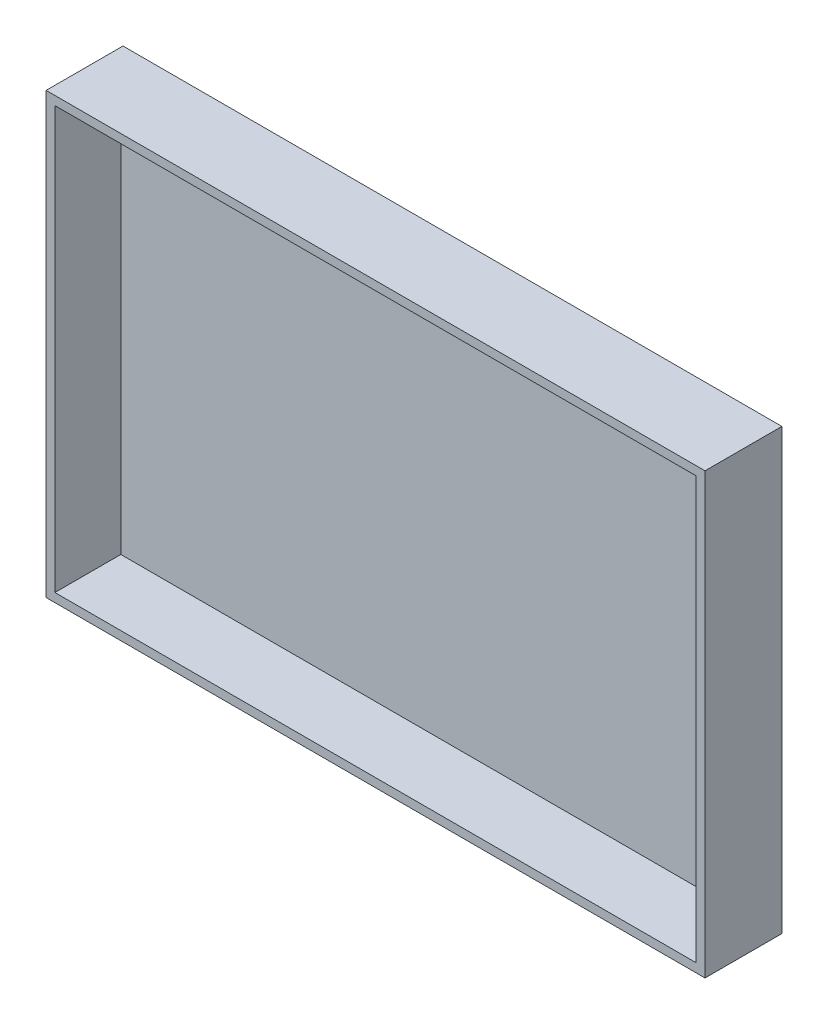
ISO-10303-21;
HEADER;
FILE_DESCRIPTION(('STEP AP214'),'2;1');
FILE_NAME('part.step','',(''),(''),'','','');
FILE_SCHEMA(('AUTOMOTIVE_DESIGN { 1 0 10303 214 1 1 1 1 }'));
ENDSEC;
DATA;
#1=APPLICATION_CONTEXT('core data for automotive mechanical design processes');
#2=APPLICATION_PROTOCOL_DEFINITION('international standard','automotive_design',2000,#1);
#3=PRODUCT_CONTEXT('',#1,'mechanical');
#4=PRODUCT('Part','Part','',(#3));
#5=PRODUCT_RELATED_PRODUCT_CATEGORY('part','',(#4));
#6=PRODUCT_DEFINITION_FORMATION('','',#4);
#7=PRODUCT_DEFINITION_CONTEXT('part definition',#1,'design');
#8=PRODUCT_DEFINITION('design','',#6,#7);
#9=PRODUCT_DEFINITION_SHAPE('','',#8);
#10=(LENGTH_UNIT() NAMED_UNIT(*) SI_UNIT(.MILLI.,.METRE.));
#11=(NAMED_UNIT(*) PLANE_ANGLE_UNIT() SI_UNIT($,.RADIAN.));
#12=(NAMED_UNIT(*) SI_UNIT($,.STERADIAN.) SOLID_ANGLE_UNIT());
#13=UNCERTAINTY_MEASURE_WITH_UNIT(LENGTH_MEASURE(1.E-05),#10,'distance_accuracy_value','');
#14=(GEOMETRIC_REPRESENTATION_CONTEXT(3) GLOBAL_UNCERTAINTY_ASSIGNED_CONTEXT((#13)) GLOBAL_UNIT_ASSIGNED_CONTEXT((#10,
#11,#12)) REPRESENTATION_CONTEXT('',''));
#15=CARTESIAN_POINT('',(0.,0.,0.));
#16=DIRECTION('',(0.,0.,1.));
#17=DIRECTION('',(1.,0.,0.));
#18=AXIS2_PLACEMENT_3D('',#15,#16,#17);
#19=CARTESIAN_POINT('',(0.,0.,10.));
#20=DIRECTION('',(1.,0.,0.));
#21=DIRECTION('',(0.,0.,-1.));
#22=AXIS2_PLACEMENT_3D('',#19,#20,#21);
#23=PLANE('',#22);
#24=DIRECTION('',(0.,-1.,0.));
#25=VECTOR('',#24,1.);
#26=CARTESIAN_POINT('',(0.,0.,0.));
#27=LINE('',#26,#25);
#28=CARTESIAN_POINT('',(0.,400.,0.));
#29=VERTEX_POINT('',#28);
#30=CARTESIAN_POINT('',(0.,0.,0.));
#31=VERTEX_POINT('',#30);
#32=EDGE_CURVE('E150',#29,#31,#27,.T.);
#33=ORIENTED_EDGE('',*,*,#32,.T.);
#34=DIRECTION('',(0.,0.,-1.));
#35=VECTOR('',#34,1.);
#36=CARTESIAN_POINT('',(0.,0.,10.));
#37=LINE('',#36,#35);
#38=CARTESIAN_POINT('',(0.,0.,70.));
#39=VERTEX_POINT('',#38);
#40=EDGE_CURVE('E11',#39,#31,#37,.T.);
#41=ORIENTED_EDGE('',*,*,#40,.F.);
#42=DIRECTION('',(0.,-1.,0.));
#43=VECTOR('',#42,1.);
#44=CARTESIAN_POINT('',(0.,400.,70.));
#45=LINE('',#44,#43);
#46=CARTESIAN_POINT('',(0.,400.,70.));
#47=VERTEX_POINT('',#46);
#48=EDGE_CURVE('E141',#47,#39,#45,.T.);
#49=ORIENTED_EDGE('',*,*,#48,.F.);
#50=DIRECTION('',(0.,0.,-1.));
#51=VECTOR('',#50,1.);
#52=CARTESIAN_POINT('',(0.,400.,10.));
#53=LINE('',#52,#51);
#54=EDGE_CURVE('E158',#47,#29,#53,.T.);
#55=ORIENTED_EDGE('',*,*,#54,.T.);
#56=EDGE_LOOP('',(#33,#41,#49,#55));
#57=FACE_BOUND('',#56,.T.);
#58=ADVANCED_FACE('F33',(#57),#23,.F.);
#59=CARTESIAN_POINT('',(0.,0.,10.));
#60=DIRECTION('',(0.,1.,0.));
#61=DIRECTION('',(0.,0.,1.));
#62=AXIS2_PLACEMENT_3D('',#59,#60,#61);
#63=PLANE('',#62);
#64=DIRECTION('',(1.,0.,0.));
#65=VECTOR('',#64,1.);
#66=CARTESIAN_POINT('',(0.,0.,0.));
#67=LINE('',#66,#65);
#68=CARTESIAN_POINT('',(600.,0.,0.));
#69=VERTEX_POINT('',#68);
#70=EDGE_CURVE('E153',#31,#69,#67,.T.);
#71=ORIENTED_EDGE('',*,*,#70,.T.);
#72=DIRECTION('',(0.,0.,-1.));
#73=VECTOR('',#72,1.);
#74=CARTESIAN_POINT('',(600.,0.,10.));
#75=LINE('',#74,#73);
#76=CARTESIAN_POINT('',(600.,0.,70.));
#77=VERTEX_POINT('',#76);
#78=EDGE_CURVE('E40',#77,#69,#75,.T.);
#79=ORIENTED_EDGE('',*,*,#78,.F.);
#80=DIRECTION('',(1.,0.,0.));
#81=VECTOR('',#80,1.);
#82=CARTESIAN_POINT('',(0.,0.,70.));
#83=LINE('',#82,#81);
#84=EDGE_CURVE('E144',#39,#77,#83,.T.);
#85=ORIENTED_EDGE('',*,*,#84,.F.);
#86=ORIENTED_EDGE('',*,*,#40,.T.);
#87=EDGE_LOOP('',(#71,#79,#85,#86));
#88=FACE_BOUND('',#87,.T.);
#89=ADVANCED_FACE('F176',(#88),#63,.F.);
#90=CARTESIAN_POINT('',(600.,0.,10.));
#91=DIRECTION('',(-1.,0.,0.));
#92=DIRECTION('',(0.,0.,1.));
#93=AXIS2_PLACEMENT_3D('',#90,#91,#92);
#94=PLANE('',#93);
#95=DIRECTION('',(0.,1.,0.));
#96=VECTOR('',#95,1.);
#97=CARTESIAN_POINT('',(600.,0.,0.));
#98=LINE('',#97,#96);
#99=CARTESIAN_POINT('',(600.,400.,0.));
#100=VERTEX_POINT('',#99);
#101=EDGE_CURVE('E155',#69,#100,#98,.T.);
#102=ORIENTED_EDGE('',*,*,#101,.T.);
#103=DIRECTION('',(0.,0.,-1.));
#104=VECTOR('',#103,1.);
#105=CARTESIAN_POINT('',(600.,400.,10.));
#106=LINE('',#105,#104);
#107=CARTESIAN_POINT('',(600.,400.,70.));
#108=VERTEX_POINT('',#107);
#109=EDGE_CURVE('E160',#108,#100,#106,.T.);
#110=ORIENTED_EDGE('',*,*,#109,.F.);
#111=DIRECTION('',(0.,1.,0.));
#112=VECTOR('',#111,1.);
#113=CARTESIAN_POINT('',(600.,0.,70.));
#114=LINE('',#113,#112);
#115=EDGE_CURVE('E147',#77,#108,#114,.T.);
#116=ORIENTED_EDGE('',*,*,#115,.F.);
#117=ORIENTED_EDGE('',*,*,#78,.T.);
#118=EDGE_LOOP('',(#102,#110,#116,#117));
#119=FACE_BOUND('',#118,.T.);
#120=ADVANCED_FACE('F165',(#119),#94,.F.);
#121=CARTESIAN_POINT('',(0.,400.,10.));
#122=DIRECTION('',(0.,-1.,0.));
#123=DIRECTION('',(0.,0.,-1.));
#124=AXIS2_PLACEMENT_3D('',#121,#122,#123);
#125=PLANE('',#124);
#126=DIRECTION('',(-1.,0.,0.));
#127=VECTOR('',#126,1.);
#128=CARTESIAN_POINT('',(0.,400.,0.));
#129=LINE('',#128,#127);
#130=EDGE_CURVE('E55',#100,#29,#129,.T.);
#131=ORIENTED_EDGE('',*,*,#130,.T.);
#132=ORIENTED_EDGE('',*,*,#54,.F.);
#133=DIRECTION('',(-1.,0.,0.));
#134=VECTOR('',#133,1.);
#135=CARTESIAN_POINT('',(600.,400.,70.));
#136=LINE('',#135,#134);
#137=EDGE_CURVE('E115',#108,#47,#136,.T.);
#138=ORIENTED_EDGE('',*,*,#137,.F.);
#139=ORIENTED_EDGE('',*,*,#109,.T.);
#140=EDGE_LOOP('',(#131,#132,#138,#139));
#141=FACE_BOUND('',#140,.T.);
#142=ADVANCED_FACE('F174',(#141),#125,.F.);
#143=CARTESIAN_POINT('',(0.,0.,0.));
#144=DIRECTION('',(0.,0.,-1.));
#145=DIRECTION('',(-1.,0.,0.));
#146=AXIS2_PLACEMENT_3D('',#143,#144,#145);
#147=PLANE('',#146);
#148=ORIENTED_EDGE('',*,*,#32,.F.);
#149=ORIENTED_EDGE('',*,*,#130,.F.);
#150=ORIENTED_EDGE('',*,*,#101,.F.);
#151=ORIENTED_EDGE('',*,*,#70,.F.);
#152=EDGE_LOOP('',(#148,#149,#150,#151));
#153=FACE_BOUND('',#152,.T.);
#154=ADVANCED_FACE('F170',(#153),#147,.T.);
#155=CARTESIAN_POINT('',(0.,0.,70.));
#156=DIRECTION('',(0.,0.,1.));
#157=DIRECTION('',(1.,0.,0.));
#158=AXIS2_PLACEMENT_3D('',#155,#156,#157);
#159=PLANE('',#158);
#160=ORIENTED_EDGE('',*,*,#137,.T.);
#161=ORIENTED_EDGE('',*,*,#48,.T.);
#162=ORIENTED_EDGE('',*,*,#84,.T.);
#163=ORIENTED_EDGE('',*,*,#115,.T.);
#164=EDGE_LOOP('',(#160,#161,#162,#163));
#165=FACE_BOUND('',#164,.T.);
#166=DIRECTION('',(0.,-1.,0.));
#167=VECTOR('',#166,1.);
#168=CARTESIAN_POINT('',(8.,392.,70.));
#169=LINE('',#168,#167);
#170=CARTESIAN_POINT('',(8.,392.,70.));
#171=VERTEX_POINT('',#170);
#172=CARTESIAN_POINT('',(8.00000000000005,8.,70.));
#173=VERTEX_POINT('',#172);
#174=EDGE_CURVE('E107',#171,#173,#169,.T.);
#175=ORIENTED_EDGE('',*,*,#174,.F.);
#176=DIRECTION('',(-1.,0.,0.));
#177=VECTOR('',#176,1.);
#178=CARTESIAN_POINT('',(592.,392.,70.));
#179=LINE('',#178,#177);
#180=CARTESIAN_POINT('',(592.,392.,70.));
#181=VERTEX_POINT('',#180);
#182=EDGE_CURVE('E99',#181,#171,#179,.T.);
#183=ORIENTED_EDGE('',*,*,#182,.F.);
#184=DIRECTION('',(0.,1.,0.));
#185=VECTOR('',#184,1.);
#186=CARTESIAN_POINT('',(592.,8.00000000000004,70.));
#187=LINE('',#186,#185);
#188=CARTESIAN_POINT('',(592.,8.00000000000004,70.));
#189=VERTEX_POINT('',#188);
#190=EDGE_CURVE('E123',#189,#181,#187,.T.);
#191=ORIENTED_EDGE('',*,*,#190,.F.);
#192=DIRECTION('',(1.,0.,0.));
#193=VECTOR('',#192,1.);
#194=CARTESIAN_POINT('',(8.00000000000005,8.,70.));
#195=LINE('',#194,#193);
#196=EDGE_CURVE('E121',#173,#189,#195,.T.);
#197=ORIENTED_EDGE('',*,*,#196,.F.);
#198=EDGE_LOOP('',(#175,#183,#191,#197));
#199=FACE_BOUND('',#198,.T.);
#200=ADVANCED_FACE('F119',(#165,#199),#159,.T.);
#201=CARTESIAN_POINT('',(592.,392.,70.));
#202=DIRECTION('',(0.,-1.,0.));
#203=DIRECTION('',(1.,0.,0.));
#204=AXIS2_PLACEMENT_3D('',#201,#202,#203);
#205=PLANE('',#204);
#206=DIRECTION('',(-1.,0.,0.));
#207=VECTOR('',#206,1.);
#208=CARTESIAN_POINT('',(592.,392.,10.));
#209=LINE('',#208,#207);
#210=CARTESIAN_POINT('',(592.,392.,10.));
#211=VERTEX_POINT('',#210);
#212=CARTESIAN_POINT('',(8.,392.,10.));
#213=VERTEX_POINT('',#212);
#214=EDGE_CURVE('E127',#211,#213,#209,.T.);
#215=ORIENTED_EDGE('',*,*,#214,.F.);
#216=DIRECTION('',(0.,0.,-1.));
#217=VECTOR('',#216,1.);
#218=CARTESIAN_POINT('',(592.,392.,70.));
#219=LINE('',#218,#217);
#220=EDGE_CURVE('E47',#181,#211,#219,.T.);
#221=ORIENTED_EDGE('',*,*,#220,.F.);
#222=ORIENTED_EDGE('',*,*,#182,.T.);
#223=DIRECTION('',(0.,0.,-1.));
#224=VECTOR('',#223,1.);
#225=CARTESIAN_POINT('',(8.,392.,70.));
#226=LINE('',#225,#224);
#227=EDGE_CURVE('E102',#171,#213,#226,.T.);
#228=ORIENTED_EDGE('',*,*,#227,.T.);
#229=EDGE_LOOP('',(#215,#221,#222,#228));
#230=FACE_BOUND('',#229,.T.);
#231=ADVANCED_FACE('F101',(#230),#205,.T.);
#232=CARTESIAN_POINT('',(8.,392.,70.));
#233=DIRECTION('',(1.,0.,0.));
#234=DIRECTION('',(0.,1.,0.));
#235=AXIS2_PLACEMENT_3D('',#232,#233,#234);
#236=PLANE('',#235);
#237=DIRECTION('',(0.,-1.,0.));
#238=VECTOR('',#237,1.);
#239=CARTESIAN_POINT('',(8.,392.,10.));
#240=LINE('',#239,#238);
#241=CARTESIAN_POINT('',(8.00000000000005,8.,10.));
#242=VERTEX_POINT('',#241);
#243=EDGE_CURVE('E114',#213,#242,#240,.T.);
#244=ORIENTED_EDGE('',*,*,#243,.F.);
#245=ORIENTED_EDGE('',*,*,#227,.F.);
#246=ORIENTED_EDGE('',*,*,#174,.T.);
#247=DIRECTION('',(0.,0.,-1.));
#248=VECTOR('',#247,1.);
#249=CARTESIAN_POINT('',(8.00000000000005,8.,70.));
#250=LINE('',#249,#248);
#251=EDGE_CURVE('E116',#173,#242,#250,.T.);
#252=ORIENTED_EDGE('',*,*,#251,.T.);
#253=EDGE_LOOP('',(#244,#245,#246,#252));
#254=FACE_BOUND('',#253,.T.);
#255=ADVANCED_FACE('F111',(#254),#236,.T.);
#256=CARTESIAN_POINT('',(8.00000000000005,8.,70.));
#257=DIRECTION('',(0.,1.,0.));
#258=DIRECTION('',(-1.,0.,0.));
#259=AXIS2_PLACEMENT_3D('',#256,#257,#258);
#260=PLANE('',#259);
#261=DIRECTION('',(1.,0.,0.));
#262=VECTOR('',#261,1.);
#263=CARTESIAN_POINT('',(8.00000000000005,8.,10.));
#264=LINE('',#263,#262);
#265=CARTESIAN_POINT('',(592.,8.00000000000004,10.));
#266=VERTEX_POINT('',#265);
#267=EDGE_CURVE('E130',#242,#266,#264,.T.);
#268=ORIENTED_EDGE('',*,*,#267,.F.);
#269=ORIENTED_EDGE('',*,*,#251,.F.);
#270=ORIENTED_EDGE('',*,*,#196,.T.);
#271=DIRECTION('',(0.,0.,-1.));
#272=VECTOR('',#271,1.);
#273=CARTESIAN_POINT('',(592.,8.00000000000004,70.));
#274=LINE('',#273,#272);
#275=EDGE_CURVE('E136',#189,#266,#274,.T.);
#276=ORIENTED_EDGE('',*,*,#275,.T.);
#277=EDGE_LOOP('',(#268,#269,#270,#276));
#278=FACE_BOUND('',#277,.T.);
#279=ADVANCED_FACE('F199',(#278),#260,.T.);
#280=CARTESIAN_POINT('',(592.,8.00000000000004,70.));
#281=DIRECTION('',(-1.,0.,0.));
#282=DIRECTION('',(0.,0.,1.));
#283=AXIS2_PLACEMENT_3D('',#280,#281,#282);
#284=PLANE('',#283);
#285=DIRECTION('',(0.,1.,0.));
#286=VECTOR('',#285,1.);
#287=CARTESIAN_POINT('',(592.,8.00000000000004,10.));
#288=LINE('',#287,#286);
#289=EDGE_CURVE('E108',#266,#211,#288,.T.);
#290=ORIENTED_EDGE('',*,*,#289,.F.);
#291=ORIENTED_EDGE('',*,*,#275,.F.);
#292=ORIENTED_EDGE('',*,*,#190,.T.);
#293=ORIENTED_EDGE('',*,*,#220,.T.);
#294=EDGE_LOOP('',(#290,#291,#292,#293));
#295=FACE_BOUND('',#294,.T.);
#296=ADVANCED_FACE('F191',(#295),#284,.T.);
#297=CARTESIAN_POINT('',(0.,0.,10.));
#298=DIRECTION('',(0.,0.,-1.));
#299=DIRECTION('',(-1.,0.,0.));
#300=AXIS2_PLACEMENT_3D('',#297,#298,#299);
#301=PLANE('',#300);
#302=ORIENTED_EDGE('',*,*,#289,.T.);
#303=ORIENTED_EDGE('',*,*,#214,.T.);
#304=ORIENTED_EDGE('',*,*,#243,.T.);
#305=ORIENTED_EDGE('',*,*,#267,.T.);
#306=EDGE_LOOP('',(#302,#303,#304,#305));
#307=FACE_BOUND('',#306,.T.);
#308=ADVANCED_FACE('F188',(#307),#301,.F.);
#309=CLOSED_SHELL('',(#58,#89,#120,#142,#154,#200,#231,#255,#279,#296,#308));
#310=MANIFOLD_SOLID_BREP('B2',#309);
#311=ADVANCED_BREP_SHAPE_REPRESENTATION('',(#18,#310),#14);
#312=SHAPE_DEFINITION_REPRESENTATION(#9,#311);
ENDSEC;
END-ISO-10303-21;
